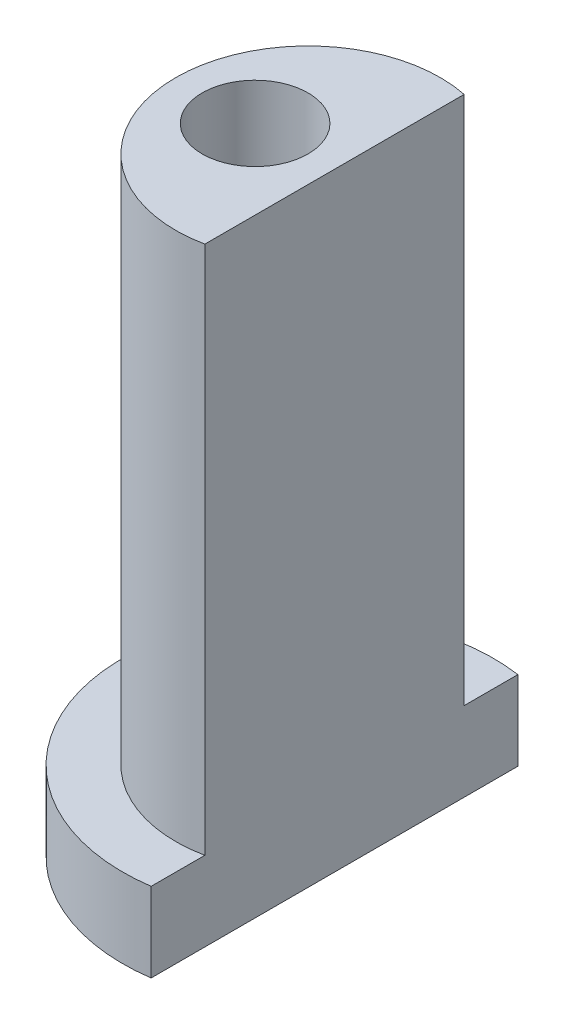
ISO-10303-21;
HEADER;
FILE_DESCRIPTION(('STEP AP214'),'2;1');
FILE_NAME('part.step','',(''),(''),'','','');
FILE_SCHEMA(('AUTOMOTIVE_DESIGN { 1 0 10303 214 1 1 1 1 }'));
ENDSEC;
DATA;
#1=APPLICATION_CONTEXT('core data for automotive mechanical design processes');
#2=APPLICATION_PROTOCOL_DEFINITION('international standard','automotive_design',2000,#1);
#3=PRODUCT_CONTEXT('',#1,'mechanical');
#4=PRODUCT('Part','Part','',(#3));
#5=PRODUCT_RELATED_PRODUCT_CATEGORY('part','',(#4));
#6=PRODUCT_DEFINITION_FORMATION('','',#4);
#7=PRODUCT_DEFINITION_CONTEXT('part definition',#1,'design');
#8=PRODUCT_DEFINITION('design','',#6,#7);
#9=PRODUCT_DEFINITION_SHAPE('','',#8);
#10=(LENGTH_UNIT() NAMED_UNIT(*) SI_UNIT(.MILLI.,.METRE.));
#11=(NAMED_UNIT(*) PLANE_ANGLE_UNIT() SI_UNIT($,.RADIAN.));
#12=(NAMED_UNIT(*) SI_UNIT($,.STERADIAN.) SOLID_ANGLE_UNIT());
#13=UNCERTAINTY_MEASURE_WITH_UNIT(LENGTH_MEASURE(1.E-05),#10,'distance_accuracy_value','');
#14=(GEOMETRIC_REPRESENTATION_CONTEXT(3) GLOBAL_UNCERTAINTY_ASSIGNED_CONTEXT((#13)) GLOBAL_UNIT_ASSIGNED_CONTEXT((#10,
#11,#12)) REPRESENTATION_CONTEXT('',''));
#15=CARTESIAN_POINT('',(0.,0.,0.));
#16=DIRECTION('',(0.,0.,1.));
#17=DIRECTION('',(1.,0.,0.));
#18=AXIS2_PLACEMENT_3D('',#15,#16,#17);
#19=CARTESIAN_POINT('',(0.,3.,0.));
#20=DIRECTION('',(0.,-1.,0.));
#21=DIRECTION('',(0.,0.,-1.));
#22=AXIS2_PLACEMENT_3D('',#19,#20,#21);
#23=CYLINDRICAL_SURFACE('',#22,7.);
#24=CARTESIAN_POINT('',(0.,0.,0.));
#25=DIRECTION('',(0.,1.,0.));
#26=DIRECTION('',(0.,0.,1.));
#27=AXIS2_PLACEMENT_3D('',#24,#25,#26);
#28=CIRCLE('',#27,7.);
#29=CARTESIAN_POINT('',(0.999999999999999,0.,-6.92820323027551));
#30=VERTEX_POINT('',#29);
#31=CARTESIAN_POINT('',(1.,0.,6.92820323027551));
#32=VERTEX_POINT('',#31);
#33=EDGE_CURVE('E82',#30,#32,#28,.T.);
#34=ORIENTED_EDGE('',*,*,#33,.T.);
#35=DIRECTION('',(0.,-1.,0.));
#36=VECTOR('',#35,1.);
#37=CARTESIAN_POINT('',(1.,3.,6.92820323027551));
#38=LINE('',#37,#36);
#39=CARTESIAN_POINT('',(1.,3.,6.92820323027551));
#40=VERTEX_POINT('',#39);
#41=EDGE_CURVE('E75',#32,#40,#38,.F.);
#42=ORIENTED_EDGE('',*,*,#41,.T.);
#43=CARTESIAN_POINT('',(0.,3.,0.));
#44=DIRECTION('',(0.,1.,0.));
#45=DIRECTION('',(0.,0.,1.));
#46=AXIS2_PLACEMENT_3D('',#43,#44,#45);
#47=CIRCLE('',#46,7.);
#48=CARTESIAN_POINT('',(0.999999999999999,3.,-6.92820323027551));
#49=VERTEX_POINT('',#48);
#50=EDGE_CURVE('E84',#49,#40,#47,.T.);
#51=ORIENTED_EDGE('',*,*,#50,.F.);
#52=DIRECTION('',(0.,1.,0.));
#53=VECTOR('',#52,1.);
#54=CARTESIAN_POINT('',(0.999999999999999,0.,-6.92820323027551));
#55=LINE('',#54,#53);
#56=EDGE_CURVE('E73',#30,#49,#55,.T.);
#57=ORIENTED_EDGE('',*,*,#56,.F.);
#58=EDGE_LOOP('',(#34,#42,#51,#57));
#59=FACE_BOUND('',#58,.T.);
#60=ADVANCED_FACE('F35',(#59),#23,.T.);
#61=CARTESIAN_POINT('',(0.,3.,0.));
#62=DIRECTION('',(0.,1.,0.));
#63=DIRECTION('',(0.,0.,1.));
#64=AXIS2_PLACEMENT_3D('',#61,#62,#63);
#65=PLANE('',#64);
#66=DIRECTION('',(0.,0.,1.));
#67=VECTOR('',#66,1.);
#68=CARTESIAN_POINT('',(1.,3.,0.));
#69=LINE('',#68,#67);
#70=CARTESIAN_POINT('',(0.999999999999999,3.,-4.89897948556636));
#71=VERTEX_POINT('',#70);
#72=EDGE_CURVE('E53',#49,#71,#69,.T.);
#73=ORIENTED_EDGE('',*,*,#72,.F.);
#74=ORIENTED_EDGE('',*,*,#50,.T.);
#75=CARTESIAN_POINT('',(1.,3.,4.89897948556636));
#76=VERTEX_POINT('',#75);
#77=EDGE_CURVE('E103',#76,#40,#69,.T.);
#78=ORIENTED_EDGE('',*,*,#77,.F.);
#79=CARTESIAN_POINT('',(0.,3.,0.));
#80=DIRECTION('',(0.,1.,0.));
#81=DIRECTION('',(0.,0.,1.));
#82=AXIS2_PLACEMENT_3D('',#79,#80,#81);
#83=CIRCLE('',#82,5.);
#84=EDGE_CURVE('E42',#71,#76,#83,.T.);
#85=ORIENTED_EDGE('',*,*,#84,.F.);
#86=EDGE_LOOP('',(#73,#74,#78,#85));
#87=FACE_BOUND('',#86,.T.);
#88=ADVANCED_FACE('F128',(#87),#65,.T.);
#89=CARTESIAN_POINT('',(0.,0.,0.));
#90=DIRECTION('',(0.,1.,0.));
#91=DIRECTION('',(0.,0.,1.));
#92=AXIS2_PLACEMENT_3D('',#89,#90,#91);
#93=PLANE('',#92);
#94=CARTESIAN_POINT('',(-2.,0.,0.));
#95=DIRECTION('',(0.,1.,0.));
#96=DIRECTION('',(0.,0.,1.));
#97=AXIS2_PLACEMENT_3D('',#94,#95,#96);
#98=CIRCLE('',#97,2.);
#99=CARTESIAN_POINT('',(-2.,0.,2.));
#100=VERTEX_POINT('',#99);
#101=EDGE_CURVE('E91',#100,#100,#98,.T.);
#102=ORIENTED_EDGE('',*,*,#101,.T.);
#103=EDGE_LOOP('',(#102));
#104=FACE_BOUND('',#103,.T.);
#105=ORIENTED_EDGE('',*,*,#33,.F.);
#106=DIRECTION('',(0.,0.,1.));
#107=VECTOR('',#106,1.);
#108=CARTESIAN_POINT('',(0.999999999999999,0.,-6.92820323027551));
#109=LINE('',#108,#107);
#110=EDGE_CURVE('E70',#30,#32,#109,.T.);
#111=ORIENTED_EDGE('',*,*,#110,.T.);
#112=EDGE_LOOP('',(#105,#111));
#113=FACE_BOUND('',#112,.T.);
#114=ADVANCED_FACE('F87',(#104,#113),#93,.F.);
#115=CARTESIAN_POINT('',(0.,23.,0.));
#116=DIRECTION('',(0.,-1.,0.));
#117=DIRECTION('',(0.,0.,-1.));
#118=AXIS2_PLACEMENT_3D('',#115,#116,#117);
#119=CYLINDRICAL_SURFACE('',#118,5.);
#120=CARTESIAN_POINT('',(0.,23.,0.));
#121=DIRECTION('',(0.,1.,0.));
#122=DIRECTION('',(0.,0.,1.));
#123=AXIS2_PLACEMENT_3D('',#120,#121,#122);
#124=CIRCLE('',#123,5.);
#125=CARTESIAN_POINT('',(0.999999999999999,23.,-4.89897948556636));
#126=VERTEX_POINT('',#125);
#127=CARTESIAN_POINT('',(1.,23.,4.89897948556636));
#128=VERTEX_POINT('',#127);
#129=EDGE_CURVE('E88',#126,#128,#124,.T.);
#130=ORIENTED_EDGE('',*,*,#129,.F.);
#131=DIRECTION('',(0.,-1.,0.));
#132=VECTOR('',#131,1.);
#133=CARTESIAN_POINT('',(0.999999999999999,23.,-4.89897948556636));
#134=LINE('',#133,#132);
#135=EDGE_CURVE('E48',#126,#71,#134,.T.);
#136=ORIENTED_EDGE('',*,*,#135,.T.);
#137=ORIENTED_EDGE('',*,*,#84,.T.);
#138=DIRECTION('',(0.,-1.,0.));
#139=VECTOR('',#138,1.);
#140=CARTESIAN_POINT('',(1.,23.,4.89897948556636));
#141=LINE('',#140,#139);
#142=EDGE_CURVE('E85',#76,#128,#141,.F.);
#143=ORIENTED_EDGE('',*,*,#142,.T.);
#144=EDGE_LOOP('',(#130,#136,#137,#143));
#145=FACE_BOUND('',#144,.T.);
#146=ADVANCED_FACE('F108',(#145),#119,.T.);
#147=CARTESIAN_POINT('',(0.,23.,0.));
#148=DIRECTION('',(0.,1.,0.));
#149=DIRECTION('',(0.,0.,1.));
#150=AXIS2_PLACEMENT_3D('',#147,#148,#149);
#151=PLANE('',#150);
#152=DIRECTION('',(0.,0.,1.));
#153=VECTOR('',#152,1.);
#154=CARTESIAN_POINT('',(1.,23.,0.));
#155=LINE('',#154,#153);
#156=EDGE_CURVE('E11',#126,#128,#155,.T.);
#157=ORIENTED_EDGE('',*,*,#156,.F.);
#158=ORIENTED_EDGE('',*,*,#129,.T.);
#159=EDGE_LOOP('',(#157,#158));
#160=FACE_BOUND('',#159,.T.);
#161=CARTESIAN_POINT('',(-2.,23.,0.));
#162=DIRECTION('',(0.,1.,0.));
#163=DIRECTION('',(0.,0.,1.));
#164=AXIS2_PLACEMENT_3D('',#161,#162,#163);
#165=CIRCLE('',#164,2.);
#166=CARTESIAN_POINT('',(-2.,23.,2.));
#167=VERTEX_POINT('',#166);
#168=EDGE_CURVE('E96',#167,#167,#165,.T.);
#169=ORIENTED_EDGE('',*,*,#168,.F.);
#170=EDGE_LOOP('',(#169));
#171=FACE_BOUND('',#170,.T.);
#172=ADVANCED_FACE('F112',(#160,#171),#151,.T.);
#173=CARTESIAN_POINT('',(-2.,0.,0.));
#174=DIRECTION('',(0.,1.,0.));
#175=DIRECTION('',(0.,0.,1.));
#176=AXIS2_PLACEMENT_3D('',#173,#174,#175);
#177=CYLINDRICAL_SURFACE('',#176,2.);
#178=ORIENTED_EDGE('',*,*,#101,.F.);
#179=EDGE_LOOP('',(#178));
#180=FACE_BOUND('',#179,.T.);
#181=ORIENTED_EDGE('',*,*,#168,.T.);
#182=EDGE_LOOP('',(#181));
#183=FACE_BOUND('',#182,.T.);
#184=ADVANCED_FACE('F115',(#180,#183),#177,.F.);
#185=CARTESIAN_POINT('',(0.999999999999999,0.,-6.92820323027551));
#186=DIRECTION('',(-1.,0.,0.));
#187=DIRECTION('',(0.,0.,1.));
#188=AXIS2_PLACEMENT_3D('',#185,#186,#187);
#189=PLANE('',#188);
#190=ORIENTED_EDGE('',*,*,#72,.T.);
#191=ORIENTED_EDGE('',*,*,#135,.F.);
#192=ORIENTED_EDGE('',*,*,#156,.T.);
#193=ORIENTED_EDGE('',*,*,#142,.F.);
#194=ORIENTED_EDGE('',*,*,#77,.T.);
#195=ORIENTED_EDGE('',*,*,#41,.F.);
#196=ORIENTED_EDGE('',*,*,#110,.F.);
#197=ORIENTED_EDGE('',*,*,#56,.T.);
#198=EDGE_LOOP('',(#190,#191,#192,#193,#194,#195,#196,#197));
#199=FACE_BOUND('',#198,.T.);
#200=ADVANCED_FACE('F72',(#199),#189,.F.);
#201=CLOSED_SHELL('',(#60,#88,#114,#146,#172,#184,#200));
#202=MANIFOLD_SOLID_BREP('B2',#201);
#203=ADVANCED_BREP_SHAPE_REPRESENTATION('',(#18,#202),#14);
#204=SHAPE_DEFINITION_REPRESENTATION(#9,#203);
ENDSEC;
END-ISO-10303-21;
